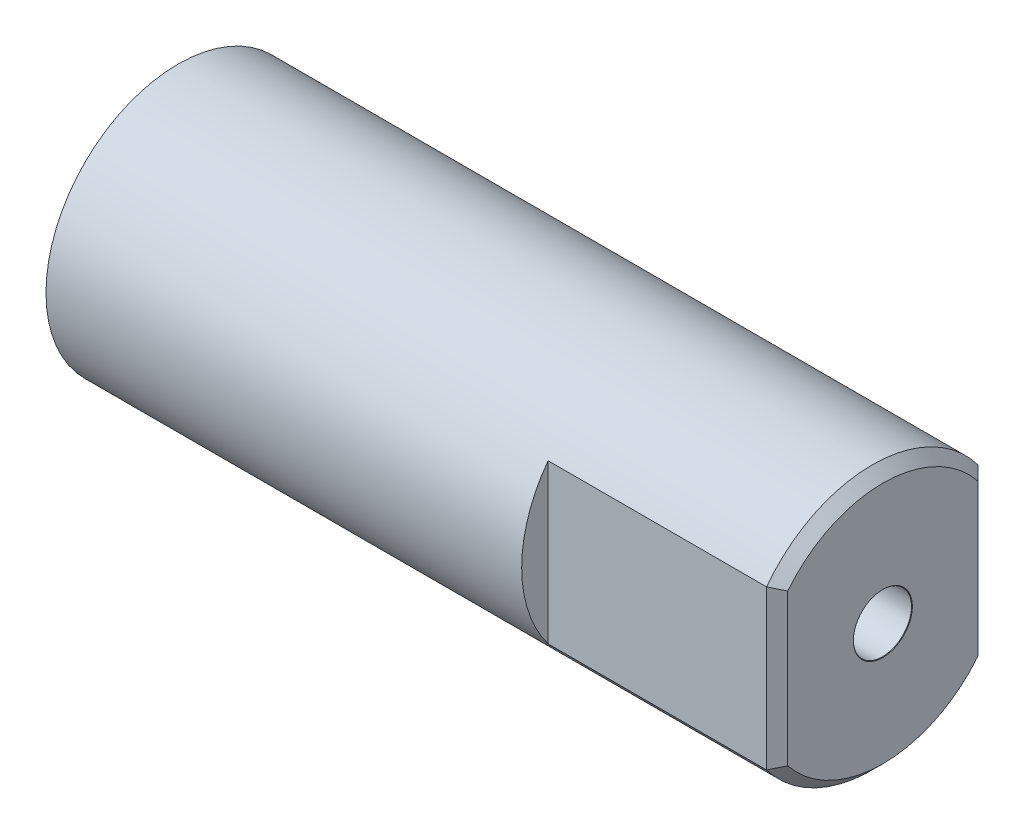
ISO-10303-21;
HEADER;
FILE_DESCRIPTION(('STEP AP214'),'2;1');
FILE_NAME('part.step','',(''),(''),'','','');
FILE_SCHEMA(('AUTOMOTIVE_DESIGN { 1 0 10303 214 1 1 1 1 }'));
ENDSEC;
DATA;
#1=APPLICATION_CONTEXT('core data for automotive mechanical design processes');
#2=APPLICATION_PROTOCOL_DEFINITION('international standard','automotive_design',2000,#1);
#3=PRODUCT_CONTEXT('',#1,'mechanical');
#4=PRODUCT('Part','Part','',(#3));
#5=PRODUCT_RELATED_PRODUCT_CATEGORY('part','',(#4));
#6=PRODUCT_DEFINITION_FORMATION('','',#4);
#7=PRODUCT_DEFINITION_CONTEXT('part definition',#1,'design');
#8=PRODUCT_DEFINITION('design','',#6,#7);
#9=PRODUCT_DEFINITION_SHAPE('','',#8);
#10=(LENGTH_UNIT() NAMED_UNIT(*) SI_UNIT(.MILLI.,.METRE.));
#11=(NAMED_UNIT(*) PLANE_ANGLE_UNIT() SI_UNIT($,.RADIAN.));
#12=(NAMED_UNIT(*) SI_UNIT($,.STERADIAN.) SOLID_ANGLE_UNIT());
#13=UNCERTAINTY_MEASURE_WITH_UNIT(LENGTH_MEASURE(1.E-05),#10,'distance_accuracy_value','');
#14=(GEOMETRIC_REPRESENTATION_CONTEXT(3) GLOBAL_UNCERTAINTY_ASSIGNED_CONTEXT((#13)) GLOBAL_UNIT_ASSIGNED_CONTEXT((#10,
#11,#12)) REPRESENTATION_CONTEXT('',''));
#15=CARTESIAN_POINT('',(0.,0.,0.));
#16=DIRECTION('',(0.,0.,1.));
#17=DIRECTION('',(1.,0.,0.));
#18=AXIS2_PLACEMENT_3D('',#15,#16,#17);
#19=CARTESIAN_POINT('',(40.,0.,0.));
#20=DIRECTION('',(1.,0.,0.));
#21=DIRECTION('',(0.,1.,0.));
#22=AXIS2_PLACEMENT_3D('',#19,#20,#21);
#23=CYLINDRICAL_SURFACE('',#22,7.5);
#24=CARTESIAN_POINT('',(0.,0.,0.));
#25=DIRECTION('',(1.,0.,0.));
#26=DIRECTION('',(0.,1.,0.));
#27=AXIS2_PLACEMENT_3D('',#24,#25,#26);
#28=CIRCLE('',#27,7.5);
#29=CARTESIAN_POINT('',(0.,7.5,0.));
#30=VERTEX_POINT('',#29);
#31=EDGE_CURVE('E154',#30,#30,#28,.T.);
#32=ORIENTED_EDGE('',*,*,#31,.T.);
#33=EDGE_LOOP('',(#32));
#34=FACE_BOUND('',#33,.T.);
#35=DIRECTION('',(1.,0.,0.));
#36=VECTOR('',#35,1.);
#37=CARTESIAN_POINT('',(27.,4.5,6.));
#38=LINE('',#37,#36);
#39=CARTESIAN_POINT('',(27.,4.5,6.));
#40=VERTEX_POINT('',#39);
#41=CARTESIAN_POINT('',(39.4,4.5,6.));
#42=VERTEX_POINT('',#41);
#43=EDGE_CURVE('E108',#40,#42,#38,.T.);
#44=ORIENTED_EDGE('',*,*,#43,.T.);
#45=CARTESIAN_POINT('',(39.4,0.,0.));
#46=DIRECTION('',(1.,0.,0.));
#47=DIRECTION('',(0.,1.,0.));
#48=AXIS2_PLACEMENT_3D('',#45,#46,#47);
#49=CIRCLE('',#48,7.5);
#50=CARTESIAN_POINT('',(39.4,4.5,-6.));
#51=VERTEX_POINT('',#50);
#52=EDGE_CURVE('E62',#42,#51,#49,.F.);
#53=ORIENTED_EDGE('',*,*,#52,.T.);
#54=DIRECTION('',(1.,0.,0.));
#55=VECTOR('',#54,1.);
#56=CARTESIAN_POINT('',(27.,4.5,-6.));
#57=LINE('',#56,#55);
#58=CARTESIAN_POINT('',(27.,4.5,-6.));
#59=VERTEX_POINT('',#58);
#60=EDGE_CURVE('E137',#59,#51,#57,.T.);
#61=ORIENTED_EDGE('',*,*,#60,.F.);
#62=CARTESIAN_POINT('',(27.,0.,0.));
#63=DIRECTION('',(1.,0.,0.));
#64=DIRECTION('',(0.,0.,-1.));
#65=AXIS2_PLACEMENT_3D('',#62,#63,#64);
#66=CIRCLE('',#65,7.5);
#67=CARTESIAN_POINT('',(27.,-4.49999999999999,-6.));
#68=VERTEX_POINT('',#67);
#69=EDGE_CURVE('E130',#68,#59,#66,.T.);
#70=ORIENTED_EDGE('',*,*,#69,.F.);
#71=DIRECTION('',(1.,0.,0.));
#72=VECTOR('',#71,1.);
#73=CARTESIAN_POINT('',(27.,-4.49999999999999,-6.));
#74=LINE('',#73,#72);
#75=CARTESIAN_POINT('',(39.4,-4.49999999999999,-6.));
#76=VERTEX_POINT('',#75);
#77=EDGE_CURVE('E122',#68,#76,#74,.T.);
#78=ORIENTED_EDGE('',*,*,#77,.T.);
#79=CARTESIAN_POINT('',(39.4,0.,0.));
#80=DIRECTION('',(1.,0.,0.));
#81=DIRECTION('',(0.,1.,0.));
#82=AXIS2_PLACEMENT_3D('',#79,#80,#81);
#83=CIRCLE('',#82,7.5);
#84=CARTESIAN_POINT('',(39.4,-4.49999999999999,6.));
#85=VERTEX_POINT('',#84);
#86=EDGE_CURVE('E76',#76,#85,#83,.F.);
#87=ORIENTED_EDGE('',*,*,#86,.T.);
#88=DIRECTION('',(1.,0.,0.));
#89=VECTOR('',#88,1.);
#90=CARTESIAN_POINT('',(27.,-4.49999999999999,6.));
#91=LINE('',#90,#89);
#92=CARTESIAN_POINT('',(27.,-4.49999999999999,6.));
#93=VERTEX_POINT('',#92);
#94=EDGE_CURVE('E116',#93,#85,#91,.T.);
#95=ORIENTED_EDGE('',*,*,#94,.F.);
#96=CARTESIAN_POINT('',(27.,0.,0.));
#97=DIRECTION('',(1.,0.,0.));
#98=DIRECTION('',(0.,0.,-1.));
#99=AXIS2_PLACEMENT_3D('',#96,#97,#98);
#100=CIRCLE('',#99,7.5);
#101=EDGE_CURVE('E117',#40,#93,#100,.T.);
#102=ORIENTED_EDGE('',*,*,#101,.F.);
#103=EDGE_LOOP('',(#44,#53,#61,#70,#78,#87,#95,#102));
#104=FACE_BOUND('',#103,.T.);
#105=ADVANCED_FACE('F46',(#34,#104),#23,.T.);
#106=CARTESIAN_POINT('',(40.,7.5,0.));
#107=DIRECTION('',(1.,0.,0.));
#108=DIRECTION('',(0.,1.,0.));
#109=AXIS2_PLACEMENT_3D('',#106,#107,#108);
#110=PLANE('',#109);
#111=CARTESIAN_POINT('',(40.,0.,0.));
#112=DIRECTION('',(1.,0.,0.));
#113=DIRECTION('',(0.,1.,0.));
#114=AXIS2_PLACEMENT_3D('',#111,#112,#113);
#115=CIRCLE('',#114,6.89999999999999);
#116=CARTESIAN_POINT('',(40.,-4.295346318983,5.39999999999991));
#117=VERTEX_POINT('',#116);
#118=CARTESIAN_POINT('',(40.,-4.295346318983,-5.39999999999991));
#119=VERTEX_POINT('',#118);
#120=EDGE_CURVE('E162',#117,#119,#115,.T.);
#121=ORIENTED_EDGE('',*,*,#120,.T.);
#122=DIRECTION('',(0.,1.,0.));
#123=VECTOR('',#122,1.);
#124=CARTESIAN_POINT('',(40.,4.5,-5.39999999999999));
#125=LINE('',#124,#123);
#126=CARTESIAN_POINT('',(40.,4.29534631898301,-5.39999999999991));
#127=VERTEX_POINT('',#126);
#128=EDGE_CURVE('E171',#119,#127,#125,.T.);
#129=ORIENTED_EDGE('',*,*,#128,.T.);
#130=CARTESIAN_POINT('',(40.,0.,0.));
#131=DIRECTION('',(1.,0.,0.));
#132=DIRECTION('',(0.,1.,0.));
#133=AXIS2_PLACEMENT_3D('',#130,#131,#132);
#134=CIRCLE('',#133,6.89999999999999);
#135=CARTESIAN_POINT('',(40.,4.29534631898301,5.39999999999999));
#136=VERTEX_POINT('',#135);
#137=EDGE_CURVE('E168',#127,#136,#134,.T.);
#138=ORIENTED_EDGE('',*,*,#137,.T.);
#139=DIRECTION('',(0.,-1.,0.));
#140=VECTOR('',#139,1.);
#141=CARTESIAN_POINT('',(40.,7.5,5.39999999999999));
#142=LINE('',#141,#140);
#143=EDGE_CURVE('E165',#136,#117,#142,.T.);
#144=ORIENTED_EDGE('',*,*,#143,.T.);
#145=EDGE_LOOP('',(#121,#129,#138,#144));
#146=FACE_BOUND('',#145,.T.);
#147=CARTESIAN_POINT('',(40.,0.,0.));
#148=DIRECTION('',(1.,0.,0.));
#149=DIRECTION('',(0.,0.,-1.));
#150=AXIS2_PLACEMENT_3D('',#147,#148,#149);
#151=CIRCLE('',#150,1.675);
#152=CARTESIAN_POINT('',(40.,0.,-1.675));
#153=VERTEX_POINT('',#152);
#154=EDGE_CURVE('E128',#153,#153,#151,.T.);
#155=ORIENTED_EDGE('',*,*,#154,.F.);
#156=EDGE_LOOP('',(#155));
#157=FACE_BOUND('',#156,.T.);
#158=ADVANCED_FACE('F221',(#146,#157),#110,.T.);
#159=CARTESIAN_POINT('',(0.,0.,0.));
#160=DIRECTION('',(-1.,0.,0.));
#161=DIRECTION('',(0.,-1.,0.));
#162=AXIS2_PLACEMENT_3D('',#159,#160,#161);
#163=PLANE('',#162);
#164=ORIENTED_EDGE('',*,*,#31,.F.);
#165=EDGE_LOOP('',(#164));
#166=FACE_BOUND('',#165,.T.);
#167=ADVANCED_FACE('F228',(#166),#163,.T.);
#168=CARTESIAN_POINT('',(30.,0.,0.));
#169=DIRECTION('',(1.,0.,0.));
#170=DIRECTION('',(0.,0.,-1.));
#171=AXIS2_PLACEMENT_3D('',#168,#169,#170);
#172=CONICAL_SURFACE('',#171,1.65,1.02974425867665);
#173=CARTESIAN_POINT('',(29.0085799786045,0.,0.));
#174=VERTEX_POINT('',#173);
#175=VERTEX_LOOP('',#174);
#176=FACE_BOUND('',#175,.T.);
#177=CARTESIAN_POINT('',(30.,0.,0.));
#178=DIRECTION('',(1.,0.,0.));
#179=DIRECTION('',(0.,0.,-1.));
#180=AXIS2_PLACEMENT_3D('',#177,#178,#179);
#181=CIRCLE('',#180,1.65);
#182=CARTESIAN_POINT('',(30.,0.,-1.65));
#183=VERTEX_POINT('',#182);
#184=EDGE_CURVE('E150',#183,#183,#181,.T.);
#185=ORIENTED_EDGE('',*,*,#184,.T.);
#186=EDGE_LOOP('',(#185));
#187=FACE_BOUND('',#186,.T.);
#188=ADVANCED_FACE('F233',(#176,#187),#172,.F.);
#189=CARTESIAN_POINT('',(40.,0.,0.));
#190=DIRECTION('',(1.,0.,0.));
#191=DIRECTION('',(0.,0.,-1.));
#192=AXIS2_PLACEMENT_3D('',#189,#190,#191);
#193=CYLINDRICAL_SURFACE('',#192,1.65);
#194=ORIENTED_EDGE('',*,*,#184,.F.);
#195=EDGE_LOOP('',(#194));
#196=FACE_BOUND('',#195,.T.);
#197=CARTESIAN_POINT('',(39.975,0.,0.));
#198=DIRECTION('',(1.,0.,0.));
#199=DIRECTION('',(0.,0.,-1.));
#200=AXIS2_PLACEMENT_3D('',#197,#198,#199);
#201=CIRCLE('',#200,1.65);
#202=CARTESIAN_POINT('',(39.975,0.,-1.65));
#203=VERTEX_POINT('',#202);
#204=EDGE_CURVE('E146',#203,#203,#201,.T.);
#205=ORIENTED_EDGE('',*,*,#204,.T.);
#206=EDGE_LOOP('',(#205));
#207=FACE_BOUND('',#206,.T.);
#208=ADVANCED_FACE('F238',(#196,#207),#193,.F.);
#209=CARTESIAN_POINT('',(40.,0.,0.));
#210=DIRECTION('',(1.,0.,0.));
#211=DIRECTION('',(0.,0.,-1.));
#212=AXIS2_PLACEMENT_3D('',#209,#210,#211);
#213=CONICAL_SURFACE('',#212,1.675,0.785398163397409);
#214=ORIENTED_EDGE('',*,*,#204,.F.);
#215=EDGE_LOOP('',(#214));
#216=FACE_BOUND('',#215,.T.);
#217=ORIENTED_EDGE('',*,*,#154,.T.);
#218=EDGE_LOOP('',(#217));
#219=FACE_BOUND('',#218,.T.);
#220=ADVANCED_FACE('F244',(#216,#219),#213,.F.);
#221=CARTESIAN_POINT('',(27.,0.,-6.));
#222=DIRECTION('',(0.,0.,1.));
#223=DIRECTION('',(1.,0.,0.));
#224=AXIS2_PLACEMENT_3D('',#221,#222,#223);
#225=PLANE('',#224);
#226=ORIENTED_EDGE('',*,*,#60,.T.);
#227=DIRECTION('',(0.,-1.,0.));
#228=VECTOR('',#227,1.);
#229=CARTESIAN_POINT('',(39.4,-4.49999999999999,-6.));
#230=LINE('',#229,#228);
#231=EDGE_CURVE('E158',#51,#76,#230,.T.);
#232=ORIENTED_EDGE('',*,*,#231,.T.);
#233=ORIENTED_EDGE('',*,*,#77,.F.);
#234=DIRECTION('',(0.,-1.,0.));
#235=VECTOR('',#234,1.);
#236=CARTESIAN_POINT('',(27.,0.,-6.));
#237=LINE('',#236,#235);
#238=EDGE_CURVE('E133',#59,#68,#237,.T.);
#239=ORIENTED_EDGE('',*,*,#238,.F.);
#240=EDGE_LOOP('',(#226,#232,#233,#239));
#241=FACE_BOUND('',#240,.T.);
#242=ADVANCED_FACE('F251',(#241),#225,.F.);
#243=CARTESIAN_POINT('',(27.,0.,0.));
#244=DIRECTION('',(1.,0.,0.));
#245=DIRECTION('',(0.,0.,-1.));
#246=AXIS2_PLACEMENT_3D('',#243,#244,#245);
#247=PLANE('',#246);
#248=ORIENTED_EDGE('',*,*,#69,.T.);
#249=ORIENTED_EDGE('',*,*,#238,.T.);
#250=EDGE_LOOP('',(#248,#249));
#251=FACE_BOUND('',#250,.T.);
#252=ADVANCED_FACE('F255',(#251),#247,.T.);
#253=CARTESIAN_POINT('',(27.,0.,6.));
#254=DIRECTION('',(0.,0.,1.));
#255=DIRECTION('',(1.,0.,0.));
#256=AXIS2_PLACEMENT_3D('',#253,#254,#255);
#257=PLANE('',#256);
#258=ORIENTED_EDGE('',*,*,#94,.T.);
#259=DIRECTION('',(0.,1.,0.));
#260=VECTOR('',#259,1.);
#261=CARTESIAN_POINT('',(39.4,0.,6.));
#262=LINE('',#261,#260);
#263=EDGE_CURVE('E11',#85,#42,#262,.T.);
#264=ORIENTED_EDGE('',*,*,#263,.T.);
#265=ORIENTED_EDGE('',*,*,#43,.F.);
#266=DIRECTION('',(0.,-1.,0.));
#267=VECTOR('',#266,1.);
#268=CARTESIAN_POINT('',(27.,0.,6.));
#269=LINE('',#268,#267);
#270=EDGE_CURVE('E111',#40,#93,#269,.T.);
#271=ORIENTED_EDGE('',*,*,#270,.T.);
#272=EDGE_LOOP('',(#258,#264,#265,#271));
#273=FACE_BOUND('',#272,.T.);
#274=ADVANCED_FACE('F110',(#273),#257,.T.);
#275=CARTESIAN_POINT('',(27.,0.,0.));
#276=DIRECTION('',(1.,0.,0.));
#277=DIRECTION('',(0.,0.,-1.));
#278=AXIS2_PLACEMENT_3D('',#275,#276,#277);
#279=PLANE('',#278);
#280=ORIENTED_EDGE('',*,*,#270,.F.);
#281=ORIENTED_EDGE('',*,*,#101,.T.);
#282=EDGE_LOOP('',(#280,#281));
#283=FACE_BOUND('',#282,.T.);
#284=ADVANCED_FACE('F120',(#283),#279,.T.);
#285=CARTESIAN_POINT('',(40.,7.5,5.39999999999999));
#286=DIRECTION('',(-0.707106781186546,0.,-0.707106781186549));
#287=DIRECTION('',(0.,-1.,0.));
#288=AXIS2_PLACEMENT_3D('',#285,#286,#287);
#289=PLANE('',#288);
#290=CARTESIAN_POINT('',(40.,-4.29534631898307,5.39999999999999));
#291=CARTESIAN_POINT('',(39.9001278690722,-4.33020521612858,5.49987213092776));
#292=CARTESIAN_POINT('',(39.80019178894,-4.36468914300638,5.59980821105995));
#293=CARTESIAN_POINT('',(39.6001917888651,-4.43290703623934,5.79980821113488));
#294=CARTESIAN_POINT('',(39.5001278689973,-4.46664100303393,5.89987213100268));
#295=CARTESIAN_POINT('',(39.4,-4.50000000000028,5.99999999999995));
#296=B_SPLINE_CURVE_WITH_KNOTS('',3,(#290,#291,#292,#293,#294,#295),.UNSPECIFIED.,.F.,.F.,(4,2,
4),(0.,0.436431246516091,0.872862237291107),.UNSPECIFIED.);
#297=EDGE_CURVE('E347',#117,#85,#296,.T.);
#298=ORIENTED_EDGE('',*,*,#297,.F.);
#299=ORIENTED_EDGE('',*,*,#143,.F.);
#300=CARTESIAN_POINT('',(40.,4.29534631898301,5.39999999999991));
#301=CARTESIAN_POINT('',(39.9001278690722,4.33020521612854,5.49987213092771));
#302=CARTESIAN_POINT('',(39.8001917889401,4.36468914300637,5.59980821105991));
#303=CARTESIAN_POINT('',(39.6001917888651,4.43290703623934,5.79980821113487));
#304=CARTESIAN_POINT('',(39.5001278689973,4.46664100303394,5.89987213100268));
#305=CARTESIAN_POINT('',(39.4,4.50000000000028,5.99999999999995));
#306=B_SPLINE_CURVE_WITH_KNOTS('',3,(#300,#301,#302,#303,#304,#305),.UNSPECIFIED.,.F.,.F.,(4,2,
4),(0.,0.436431246516124,0.872862237291179),.UNSPECIFIED.);
#307=EDGE_CURVE('E52',#42,#136,#306,.F.);
#308=ORIENTED_EDGE('',*,*,#307,.F.);
#309=ORIENTED_EDGE('',*,*,#263,.F.);
#310=EDGE_LOOP('',(#298,#299,#308,#309));
#311=FACE_BOUND('',#310,.T.);
#312=ADVANCED_FACE('F49',(#311),#289,.F.);
#313=CARTESIAN_POINT('',(40.,0.,0.));
#314=DIRECTION('',(-1.,0.,0.));
#315=DIRECTION('',(0.,-1.,0.));
#316=AXIS2_PLACEMENT_3D('',#313,#314,#315);
#317=CONICAL_SURFACE('',#316,6.89999999999999,0.785398163397447);
#318=ORIENTED_EDGE('',*,*,#307,.T.);
#319=ORIENTED_EDGE('',*,*,#137,.F.);
#320=CARTESIAN_POINT('',(40.,4.29534631898307,-5.39999999999999));
#321=CARTESIAN_POINT('',(39.9001278690722,4.33020521612858,-5.49987213092776));
#322=CARTESIAN_POINT('',(39.80019178894,4.36468914300639,-5.59980821105995));
#323=CARTESIAN_POINT('',(39.6001917888651,4.43290703623934,-5.79980821113488));
#324=CARTESIAN_POINT('',(39.5001278689973,4.46664100303394,-5.89987213100268));
#325=CARTESIAN_POINT('',(39.4,4.50000000000028,-5.99999999999995));
#326=B_SPLINE_CURVE_WITH_KNOTS('',3,(#320,#321,#322,#323,#324,#325),.UNSPECIFIED.,.F.,.F.,(4,2,
4),(0.,0.43643124651609,0.872862237291107),.UNSPECIFIED.);
#327=EDGE_CURVE('E188',#51,#127,#326,.F.);
#328=ORIENTED_EDGE('',*,*,#327,.F.);
#329=ORIENTED_EDGE('',*,*,#52,.F.);
#330=EDGE_LOOP('',(#318,#319,#328,#329));
#331=FACE_BOUND('',#330,.T.);
#332=ADVANCED_FACE('F205',(#331),#317,.T.);
#333=CARTESIAN_POINT('',(40.,0.,0.));
#334=DIRECTION('',(-1.,0.,0.));
#335=DIRECTION('',(0.,-1.,0.));
#336=AXIS2_PLACEMENT_3D('',#333,#334,#335);
#337=CONICAL_SURFACE('',#336,6.89999999999999,0.785398163397447);
#338=ORIENTED_EDGE('',*,*,#297,.T.);
#339=ORIENTED_EDGE('',*,*,#86,.F.);
#340=CARTESIAN_POINT('',(39.4,-4.49999999999999,-6.));
#341=CARTESIAN_POINT('',(39.5001278689973,-4.46664100303378,-5.89987213100271));
#342=CARTESIAN_POINT('',(39.6001917888651,-4.43290703623927,-5.79980821113489));
#343=CARTESIAN_POINT('',(39.80019178894,-4.36468914300645,-5.59980821105994));
#344=CARTESIAN_POINT('',(39.9001278690722,-4.33020521612867,-5.49987213092775));
#345=CARTESIAN_POINT('',(40.,-4.29534631898315,-5.39999999999998));
#346=B_SPLINE_CURVE_WITH_KNOTS('',3,(#340,#341,#342,#343,#344,#345),.UNSPECIFIED.,.F.,.F.,(4,2,
4),(0.,0.436430990775016,0.872862237291107),.UNSPECIFIED.);
#347=EDGE_CURVE('E179',#119,#76,#346,.F.);
#348=ORIENTED_EDGE('',*,*,#347,.F.);
#349=ORIENTED_EDGE('',*,*,#120,.F.);
#350=EDGE_LOOP('',(#338,#339,#348,#349));
#351=FACE_BOUND('',#350,.T.);
#352=ADVANCED_FACE('F194',(#351),#337,.T.);
#353=CARTESIAN_POINT('',(39.4,0.,-6.));
#354=DIRECTION('',(0.707106781186546,0.,-0.707106781186549));
#355=DIRECTION('',(0.,1.,0.));
#356=AXIS2_PLACEMENT_3D('',#353,#354,#355);
#357=PLANE('',#356);
#358=ORIENTED_EDGE('',*,*,#327,.T.);
#359=ORIENTED_EDGE('',*,*,#128,.F.);
#360=ORIENTED_EDGE('',*,*,#347,.T.);
#361=ORIENTED_EDGE('',*,*,#231,.F.);
#362=EDGE_LOOP('',(#358,#359,#360,#361));
#363=FACE_BOUND('',#362,.T.);
#364=ADVANCED_FACE('F198',(#363),#357,.T.);
#365=CLOSED_SHELL('',(#105,#158,#167,#188,#208,#220,#242,#252,#274,#284,#312,#332,#352,#364));
#366=MANIFOLD_SOLID_BREP('B2',#365);
#367=ADVANCED_BREP_SHAPE_REPRESENTATION('',(#18,#366),#14);
#368=SHAPE_DEFINITION_REPRESENTATION(#9,#367);
ENDSEC;
END-ISO-10303-21;
